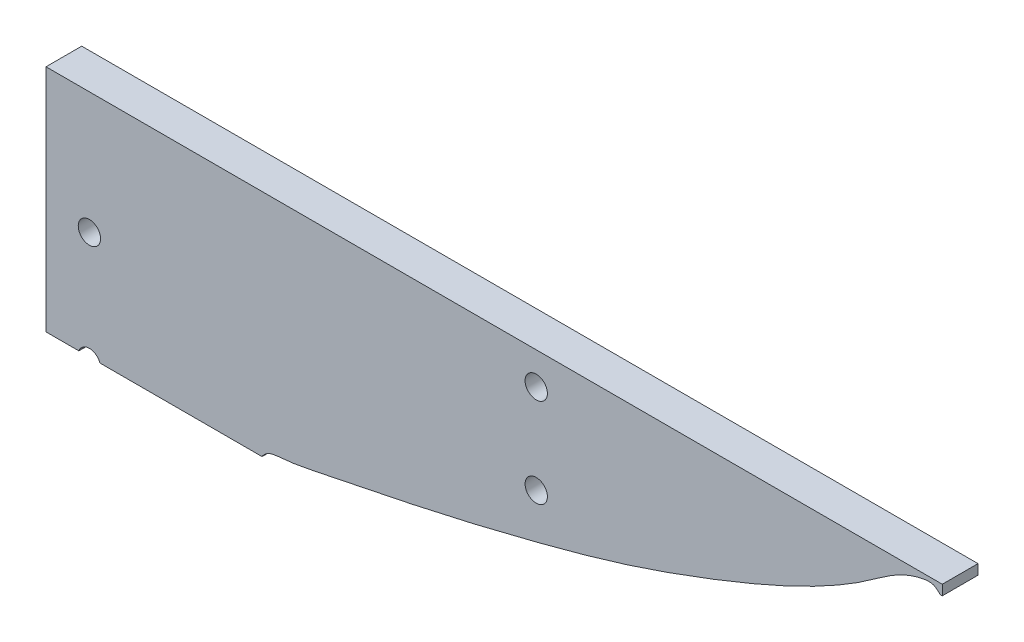
ISO-10303-21;
HEADER;
FILE_DESCRIPTION(('STEP AP214'),'2;1');
FILE_NAME('part.step','',(''),(''),'','','');
FILE_SCHEMA(('AUTOMOTIVE_DESIGN { 1 0 10303 214 1 1 1 1 }'));
ENDSEC;
DATA;
#1=APPLICATION_CONTEXT('core data for automotive mechanical design processes');
#2=APPLICATION_PROTOCOL_DEFINITION('international standard','automotive_design',2000,#1);
#3=PRODUCT_CONTEXT('',#1,'mechanical');
#4=PRODUCT('Part','Part','',(#3));
#5=PRODUCT_RELATED_PRODUCT_CATEGORY('part','',(#4));
#6=PRODUCT_DEFINITION_FORMATION('','',#4);
#7=PRODUCT_DEFINITION_CONTEXT('part definition',#1,'design');
#8=PRODUCT_DEFINITION('design','',#6,#7);
#9=PRODUCT_DEFINITION_SHAPE('','',#8);
#10=(LENGTH_UNIT() NAMED_UNIT(*) SI_UNIT(.MILLI.,.METRE.));
#11=(NAMED_UNIT(*) PLANE_ANGLE_UNIT() SI_UNIT($,.RADIAN.));
#12=(NAMED_UNIT(*) SI_UNIT($,.STERADIAN.) SOLID_ANGLE_UNIT());
#13=UNCERTAINTY_MEASURE_WITH_UNIT(LENGTH_MEASURE(1.E-05),#10,'distance_accuracy_value','');
#14=(GEOMETRIC_REPRESENTATION_CONTEXT(3) GLOBAL_UNCERTAINTY_ASSIGNED_CONTEXT((#13)) GLOBAL_UNIT_ASSIGNED_CONTEXT((#10,
#11,#12)) REPRESENTATION_CONTEXT('',''));
#15=CARTESIAN_POINT('',(0.,0.,0.));
#16=DIRECTION('',(0.,0.,1.));
#17=DIRECTION('',(1.,0.,0.));
#18=AXIS2_PLACEMENT_3D('',#15,#16,#17);
#19=CARTESIAN_POINT('',(17.1120450700349,-30.2965817213284,268.));
#20=DIRECTION('',(0.,0.,-1.));
#21=DIRECTION('',(-1.,0.,0.));
#22=AXIS2_PLACEMENT_3D('',#19,#20,#21);
#23=PLANE('',#22);
#24=CARTESIAN_POINT('',(-100.,-50.,268.));
#25=DIRECTION('',(0.,0.,-1.));
#26=DIRECTION('',(-1.,0.,0.));
#27=AXIS2_PLACEMENT_3D('',#24,#25,#26);
#28=CIRCLE('',#27,2.5);
#29=CARTESIAN_POINT('',(-97.6425404143795,-49.1679036701405,268.));
#30=VERTEX_POINT('',#29);
#31=CARTESIAN_POINT('',(-102.357685385855,-49.1685436744337,268.));
#32=VERTEX_POINT('',#31);
#33=EDGE_CURVE('E271',#30,#32,#28,.F.);
#34=ORIENTED_EDGE('',*,*,#33,.F.);
#35=CARTESIAN_POINT('',(-61.3284691167819,-49.1596786768937,268.));
#36=CARTESIAN_POINT('',(-73.4331592670355,-49.1634275257084,268.));
#37=CARTESIAN_POINT('',(-85.5378497845414,-49.1661379789345,268.));
#38=CARTESIAN_POINT('',(-97.6425404143795,-49.1679036701405,268.));
#39=B_SPLINE_CURVE_WITH_KNOTS('',3,(#35,#36,#37,#38),.UNSPECIFIED.,.F.,.F.,(4,4),
(0.249558177281323,1.),.UNSPECIFIED.);
#40=CARTESIAN_POINT('',(-61.3284691167819,-49.1596786768937,268.));
#41=VERTEX_POINT('',#40);
#42=EDGE_CURVE('E57',#30,#41,#39,.F.);
#43=ORIENTED_EDGE('',*,*,#42,.T.);
#44=CARTESIAN_POINT('',(90.4986161705741,0.,268.));
#45=CARTESIAN_POINT('',(90.460993760975,0.101798971429555,268.));
#46=CARTESIAN_POINT('',(90.3925716869674,0.187011990892654,268.));
#47=CARTESIAN_POINT('',(90.2359787684162,0.335064971160982,268.));
#48=CARTESIAN_POINT('',(90.1511215472738,0.400871782749084,268.));
#49=CARTESIAN_POINT('',(89.8975200885361,0.599507742605229,268.));
#50=CARTESIAN_POINT('',(89.7325323788648,0.737503647604979,268.));
#51=CARTESIAN_POINT('',(89.4655595987232,0.918657362101557,268.));
#52=CARTESIAN_POINT('',(89.3746892647177,0.975115261772072,268.));
#53=CARTESIAN_POINT('',(89.1860095946694,1.07353330751801,268.));
#54=CARTESIAN_POINT('',(89.087829148967,1.11471808901335,268.));
#55=CARTESIAN_POINT('',(88.8841315355537,1.18175893653473,268.));
#56=CARTESIAN_POINT('',(88.7784692306913,1.20769185659473,268.));
#57=CARTESIAN_POINT('',(88.5678653936302,1.24582942601215,268.));
#58=CARTESIAN_POINT('',(88.4620126637707,1.25840148848252,268.));
#59=CARTESIAN_POINT('',(88.1432711884111,1.2821610293223,268.));
#60=CARTESIAN_POINT('',(87.9284820156275,1.27992535578355,268.));
#61=CARTESIAN_POINT('',(87.5007692848221,1.25567140612821,268.));
#62=CARTESIAN_POINT('',(87.2888410227446,1.23461552094706,268.));
#63=CARTESIAN_POINT('',(86.6578629039191,1.14918852804751,268.));
#64=CARTESIAN_POINT('',(86.2438233475715,1.06161507295805,268.));
#65=CARTESIAN_POINT('',(85.0111622831581,0.75509720846469,268.));
#66=CARTESIAN_POINT('',(84.1980262023282,0.488821245687837,268.));
#67=CARTESIAN_POINT('',(82.6227430709735,-0.126448017694313,268.));
#68=CARTESIAN_POINT('',(81.8592891901086,-0.477860645027314,268.));
#69=CARTESIAN_POINT('',(79.6396114148434,-1.66003131844025,268.));
#70=CARTESIAN_POINT('',(78.2506945542024,-2.61261032644494,268.));
#71=CARTESIAN_POINT('',(76.1841211766647,-4.07188911121447,268.));
#72=CARTESIAN_POINT('',(75.4976799176439,-4.56248258251916,268.));
#73=CARTESIAN_POINT('',(74.1152658151134,-5.52752544320584,268.));
#74=CARTESIAN_POINT('',(73.4204228776363,-6.0039237505193,268.));
#75=CARTESIAN_POINT('',(71.315499682308,-7.39877290135613,268.));
#76=CARTESIAN_POINT('',(69.8839537206412,-8.28107378370755,268.));
#77=CARTESIAN_POINT('',(66.9812467229454,-9.97896059639708,268.));
#78=CARTESIAN_POINT('',(65.5105832519073,-10.7953844659546,268.));
#79=CARTESIAN_POINT('',(62.5414436915019,-12.3813935324912,268.));
#80=CARTESIAN_POINT('',(61.0425176373783,-13.1503815521859,268.));
#81=CARTESIAN_POINT('',(58.0157870229783,-14.6390744460416,268.));
#82=CARTESIAN_POINT('',(56.4908785981481,-15.3582396709279,268.));
#83=CARTESIAN_POINT('',(51.8890598924008,-17.4566312343581,268.));
#84=CARTESIAN_POINT('',(48.7860501937243,-18.7804252016329,268.));
#85=CARTESIAN_POINT('',(42.5456827222286,-21.3340963067129,268.));
#86=CARTESIAN_POINT('',(39.406210841033,-22.5620236467706,268.));
#87=CARTESIAN_POINT('',(33.0954653719989,-24.9372399560287,268.));
#88=CARTESIAN_POINT('',(29.9239536455423,-26.0851750318963,268.));
#89=CARTESIAN_POINT('',(23.5456823975533,-28.2755615353782,268.));
#90=CARTESIAN_POINT('',(20.3370110240277,-29.3155422840662,268.));
#91=CARTESIAN_POINT('',(13.887079116042,-31.2776211585907,268.));
#92=CARTESIAN_POINT('',(10.6453700530996,-32.2012961643472,268.));
#93=CARTESIAN_POINT('',(4.14072845552131,-33.9759313418385,268.));
#94=CARTESIAN_POINT('',(0.878330212973374,-34.8289046395145,268.));
#95=CARTESIAN_POINT('',(-5.65566984497051,-36.4941564641431,268.));
#96=CARTESIAN_POINT('',(-8.92810962490984,-37.3049529957394,268.));
#97=CARTESIAN_POINT('',(-15.4859271801644,-38.8746266919463,268.));
#98=CARTESIAN_POINT('',(-18.7718856839083,-39.6311194553094,268.));
#99=CARTESIAN_POINT('',(-25.3550010176112,-41.0923485571112,268.));
#100=CARTESIAN_POINT('',(-28.6521091009108,-41.7982403719291,268.));
#101=CARTESIAN_POINT('',(-35.2525574830584,-43.1797250799683,268.));
#102=CARTESIAN_POINT('',(-38.5549837469024,-43.8599171952072,268.));
#103=CARTESIAN_POINT('',(-43.5100113003951,-44.8733760345267,268.));
#104=CARTESIAN_POINT('',(-45.1616480688053,-45.2114167268525,268.));
#105=CARTESIAN_POINT('',(-47.6407400476689,-45.7103267513555,268.));
#106=CARTESIAN_POINT('',(-48.4673966782986,-45.8751720815977,268.));
#107=CARTESIAN_POINT('',(-50.121135924969,-46.2027403512291,268.));
#108=CARTESIAN_POINT('',(-50.9478057783205,-46.3677115866922,268.));
#109=CARTESIAN_POINT('',(-52.6037718886959,-46.682842221304,268.));
#110=CARTESIAN_POINT('',(-53.4335542319916,-46.8302998272869,268.));
#111=CARTESIAN_POINT('',(-54.6850395254958,-47.0132202737498,268.));
#112=CARTESIAN_POINT('',(-55.103304122214,-47.0680573049026,268.));
#113=CARTESIAN_POINT('',(-55.94209202885,-47.1642011811323,268.));
#114=CARTESIAN_POINT('',(-56.3630062569619,-47.2032921923246,268.));
#115=CARTESIAN_POINT('',(-57.2058433328034,-47.2755158582891,268.));
#116=CARTESIAN_POINT('',(-57.6272398904258,-47.3117575384893,268.));
#117=CARTESIAN_POINT('',(-58.4636797622931,-47.4217722811931,268.));
#118=CARTESIAN_POINT('',(-58.8794319946036,-47.4913574551859,268.));
#119=CARTESIAN_POINT('',(-59.4902276948746,-47.6715432714835,268.));
#120=CARTESIAN_POINT('',(-59.6915862205313,-47.744838110977,268.));
#121=CARTESIAN_POINT('',(-59.9878781547935,-47.8887236396108,268.));
#122=CARTESIAN_POINT('',(-60.0862397709866,-47.9429034811649,268.));
#123=CARTESIAN_POINT('',(-60.2731116971085,-48.0610483049043,268.));
#124=CARTESIAN_POINT('',(-60.362608396286,-48.1250935632572,268.));
#125=CARTESIAN_POINT('',(-60.6233237629664,-48.3270440001711,268.));
#126=CARTESIAN_POINT('',(-60.7844878959435,-48.4776418183054,268.));
#127=CARTESIAN_POINT('',(-61.0228611861699,-48.7077964374238,268.));
#128=CARTESIAN_POINT('',(-61.1012985715874,-48.7858055481782,268.));
#129=CARTESIAN_POINT('',(-61.2416001670571,-48.956251550771,268.));
#130=CARTESIAN_POINT('',(-61.3018923424804,-49.0521197570179,268.));
#131=CARTESIAN_POINT('',(-61.3284691167819,-49.1596786768938,268.));
#132=B_SPLINE_CURVE_WITH_KNOTS('',3,(#44,#45,#46,#47,#48,#49,#50,#51,#52,#53,#54,#55,#56,#57,
#58,#59,#60,#61,#62,#63,#64,#65,#66,#67,#68,#69,#70,#71,#72,#73,#74,#75,#76,#77,#78,#79,#80,#81,
#82,#83,#84,#85,#86,#87,#88,#89,#90,#91,#92,#93,#94,#95,#96,#97,#98,#99,#100,#101,#102,#103,
#104,#105,#106,#107,#108,#109,#110,#111,#112,#113,#114,#115,#116,#117,#118,#119,#120,#121,#122,
#123,#124,#125,#126,#127,#128,#129,#130,#131),.UNSPECIFIED.,.F.,.F.,(4,2,2,2,2,2,2,2,2,2,2,2,2,
2,2,2,2,2,2,2,2,2,2,2,2,2,2,2,2,2,2,2,2,2,2,2,2,2,2,2,2,2,2,4),(0.,0.001953125,
0.00390625000000011,0.00781250000000011,0.00976562500000011,0.01171875,0.0136718749999999,
0.0156249999999999,0.0195312499999997,0.0234374999999996,0.0312499999999996,0.0468749999999998,
0.0625,0.0937500000000001,0.109375,0.125,0.15625,0.1875,0.21875,0.25,0.3125,0.375,0.4375,0.5,
0.5625,0.625,0.6875,0.75,0.8125,0.875,0.90625,0.921875,0.9375,0.953125,0.9609375,0.96875,
0.9765625,0.984375,0.98828125,0.990234375,0.9921875,0.99609375,0.998046875,1.),.UNSPECIFIED.);
#133=CARTESIAN_POINT('',(90.4986161705741,0.,268.));
#134=VERTEX_POINT('',#133);
#135=EDGE_CURVE('E224',#41,#134,#132,.F.);
#136=ORIENTED_EDGE('',*,*,#135,.T.);
#137=DIRECTION('',(1.,1.89613810274532E-13,0.));
#138=VECTOR('',#137,1.);
#139=CARTESIAN_POINT('',(90.4986161705741,0.,268.));
#140=LINE('',#139,#138);
#141=CARTESIAN_POINT('',(91.0031001248854,0.,268.));
#142=VERTEX_POINT('',#141);
#143=EDGE_CURVE('E95',#134,#142,#140,.T.);
#144=ORIENTED_EDGE('',*,*,#143,.T.);
#145=DIRECTION('',(0.,1.,0.));
#146=VECTOR('',#145,1.);
#147=CARTESIAN_POINT('',(91.0031001248854,2.25600000000004,268.));
#148=LINE('',#147,#146);
#149=CARTESIAN_POINT('',(91.0031001248854,2.25600000000004,268.));
#150=VERTEX_POINT('',#149);
#151=EDGE_CURVE('E112',#142,#150,#148,.T.);
#152=ORIENTED_EDGE('',*,*,#151,.T.);
#153=DIRECTION('',(-1.,0.,0.));
#154=VECTOR('',#153,1.);
#155=CARTESIAN_POINT('',(91.0031001248854,2.25600000000004,268.));
#156=LINE('',#155,#154);
#157=CARTESIAN_POINT('',(-109.718724519512,2.25600000000002,268.));
#158=VERTEX_POINT('',#157);
#159=EDGE_CURVE('E104',#150,#158,#156,.T.);
#160=ORIENTED_EDGE('',*,*,#159,.T.);
#161=DIRECTION('',(0.,-1.,0.));
#162=VECTOR('',#161,1.);
#163=CARTESIAN_POINT('',(-109.718724519512,-49.1693552074664,268.));
#164=LINE('',#163,#162);
#165=CARTESIAN_POINT('',(-109.718724519512,-49.1693552074664,268.));
#166=VERTEX_POINT('',#165);
#167=EDGE_CURVE('E109',#158,#166,#164,.T.);
#168=ORIENTED_EDGE('',*,*,#167,.T.);
#169=CARTESIAN_POINT('',(-102.357685458832,-49.1685438813678,268.));
#170=CARTESIAN_POINT('',(-104.811365143178,-49.1688523834661,268.));
#171=CARTESIAN_POINT('',(-107.265044830779,-49.1691225655411,268.));
#172=CARTESIAN_POINT('',(-109.718724519512,-49.1693552074664,268.));
#173=B_SPLINE_CURVE_WITH_KNOTS('',3,(#169,#170,#171,#172),.UNSPECIFIED.,.F.,.F.,(4,4),(0.,
0.152118208322103),.UNSPECIFIED.);
#174=EDGE_CURVE('E131',#166,#32,#173,.F.);
#175=ORIENTED_EDGE('',*,*,#174,.T.);
#176=EDGE_LOOP('',(#34,#43,#136,#144,#152,#160,#168,#175));
#177=FACE_BOUND('',#176,.T.);
#178=CARTESIAN_POINT('',(0.0705666698621599,-4.96037406111782,268.));
#179=DIRECTION('',(0.,0.,-1.));
#180=DIRECTION('',(-1.,0.,0.));
#181=AXIS2_PLACEMENT_3D('',#178,#179,#180);
#182=CIRCLE('',#181,2.5);
#183=CARTESIAN_POINT('',(-2.42943333013784,-4.96037406111782,268.));
#184=VERTEX_POINT('',#183);
#185=EDGE_CURVE('E267',#184,#184,#182,.F.);
#186=ORIENTED_EDGE('',*,*,#185,.F.);
#187=EDGE_LOOP('',(#186));
#188=FACE_BOUND('',#187,.T.);
#189=CARTESIAN_POINT('',(0.0705666698621599,-25.,268.));
#190=DIRECTION('',(0.,0.,-1.));
#191=DIRECTION('',(-1.,0.,0.));
#192=AXIS2_PLACEMENT_3D('',#189,#190,#191);
#193=CIRCLE('',#192,2.5);
#194=CARTESIAN_POINT('',(-2.42943333013784,-25.,268.));
#195=VERTEX_POINT('',#194);
#196=EDGE_CURVE('E268',#195,#195,#193,.F.);
#197=ORIENTED_EDGE('',*,*,#196,.F.);
#198=EDGE_LOOP('',(#197));
#199=FACE_BOUND('',#198,.T.);
#200=CARTESIAN_POINT('',(-100.,-25.,268.));
#201=DIRECTION('',(0.,0.,-1.));
#202=DIRECTION('',(-1.,0.,0.));
#203=AXIS2_PLACEMENT_3D('',#200,#201,#202);
#204=CIRCLE('',#203,2.5);
#205=CARTESIAN_POINT('',(-102.5,-25.,268.));
#206=VERTEX_POINT('',#205);
#207=EDGE_CURVE('E290',#206,#206,#204,.F.);
#208=ORIENTED_EDGE('',*,*,#207,.F.);
#209=EDGE_LOOP('',(#208));
#210=FACE_BOUND('',#209,.T.);
#211=ADVANCED_FACE('F30',(#177,#188,#199,#210),#23,.F.);
#212=CARTESIAN_POINT('',(17.1120450700349,-30.2965817213284,260.));
#213=DIRECTION('',(0.,0.,-1.));
#214=DIRECTION('',(-1.,0.,0.));
#215=AXIS2_PLACEMENT_3D('',#212,#213,#214);
#216=PLANE('',#215);
#217=CARTESIAN_POINT('',(-97.6425404143795,-49.1679036701405,260.));
#218=CARTESIAN_POINT('',(-85.5378497845414,-49.1661379789345,260.));
#219=CARTESIAN_POINT('',(-73.4331592670355,-49.1634275257084,260.));
#220=CARTESIAN_POINT('',(-61.3284691167819,-49.1596786768937,260.));
#221=B_SPLINE_CURVE_WITH_KNOTS('',3,(#217,#218,#219,#220),.UNSPECIFIED.,.F.,.F.,(4,4),
(0.249558177281324,1.),.UNSPECIFIED.);
#222=CARTESIAN_POINT('',(-97.6425404144108,-49.167903455592,260.));
#223=VERTEX_POINT('',#222);
#224=CARTESIAN_POINT('',(-61.3284691167819,-49.1596786768937,260.));
#225=VERTEX_POINT('',#224);
#226=EDGE_CURVE('E85',#223,#225,#221,.T.);
#227=ORIENTED_EDGE('',*,*,#226,.F.);
#228=CARTESIAN_POINT('',(-100.,-50.,260.));
#229=DIRECTION('',(0.,0.,-1.));
#230=DIRECTION('',(-1.,0.,0.));
#231=AXIS2_PLACEMENT_3D('',#228,#229,#230);
#232=CIRCLE('',#231,2.5);
#233=CARTESIAN_POINT('',(-102.357685385894,-49.1685436745432,260.));
#234=VERTEX_POINT('',#233);
#235=EDGE_CURVE('E48',#223,#234,#232,.F.);
#236=ORIENTED_EDGE('',*,*,#235,.T.);
#237=CARTESIAN_POINT('',(-109.718724519512,-49.1693552074664,260.));
#238=CARTESIAN_POINT('',(-107.265044830779,-49.1691225655411,260.));
#239=CARTESIAN_POINT('',(-104.811365143178,-49.1688523834661,260.));
#240=CARTESIAN_POINT('',(-102.357685458832,-49.1685438813678,260.));
#241=B_SPLINE_CURVE_WITH_KNOTS('',3,(#237,#238,#239,#240),.UNSPECIFIED.,.F.,.F.,(4,4),(0.,
0.152118208322103),.UNSPECIFIED.);
#242=CARTESIAN_POINT('',(-109.718724519512,-49.1693552074664,260.));
#243=VERTEX_POINT('',#242);
#244=EDGE_CURVE('E153',#243,#234,#241,.T.);
#245=ORIENTED_EDGE('',*,*,#244,.F.);
#246=DIRECTION('',(0.,-1.,0.));
#247=VECTOR('',#246,1.);
#248=CARTESIAN_POINT('',(-109.718724519512,-49.1693552074664,260.));
#249=LINE('',#248,#247);
#250=CARTESIAN_POINT('',(-109.718724519512,2.25600000000002,260.));
#251=VERTEX_POINT('',#250);
#252=EDGE_CURVE('E187',#251,#243,#249,.T.);
#253=ORIENTED_EDGE('',*,*,#252,.F.);
#254=DIRECTION('',(-1.,0.,0.));
#255=VECTOR('',#254,1.);
#256=CARTESIAN_POINT('',(91.0031001248854,2.25600000000004,260.));
#257=LINE('',#256,#255);
#258=CARTESIAN_POINT('',(91.0031001248854,2.25600000000004,260.));
#259=VERTEX_POINT('',#258);
#260=EDGE_CURVE('E121',#259,#251,#257,.T.);
#261=ORIENTED_EDGE('',*,*,#260,.F.);
#262=DIRECTION('',(0.,1.,0.));
#263=VECTOR('',#262,1.);
#264=CARTESIAN_POINT('',(91.0031001248854,2.25600000000004,260.));
#265=LINE('',#264,#263);
#266=CARTESIAN_POINT('',(91.0031001248854,0.,260.));
#267=VERTEX_POINT('',#266);
#268=EDGE_CURVE('E181',#267,#259,#265,.T.);
#269=ORIENTED_EDGE('',*,*,#268,.F.);
#270=DIRECTION('',(1.,1.89613810274532E-13,0.));
#271=VECTOR('',#270,1.);
#272=CARTESIAN_POINT('',(90.4986161705741,0.,260.));
#273=LINE('',#272,#271);
#274=CARTESIAN_POINT('',(90.4986161705741,0.,260.));
#275=VERTEX_POINT('',#274);
#276=EDGE_CURVE('E186',#275,#267,#273,.T.);
#277=ORIENTED_EDGE('',*,*,#276,.F.);
#278=CARTESIAN_POINT('',(-61.3284691167819,-49.1596786768938,260.));
#279=CARTESIAN_POINT('',(-61.3018923424804,-49.0521197570179,260.));
#280=CARTESIAN_POINT('',(-61.2416001670571,-48.956251550771,260.));
#281=CARTESIAN_POINT('',(-61.1012985715874,-48.7858055481782,260.));
#282=CARTESIAN_POINT('',(-61.0228611861699,-48.7077964374238,260.));
#283=CARTESIAN_POINT('',(-60.7844878959435,-48.4776418183054,260.));
#284=CARTESIAN_POINT('',(-60.6233237629664,-48.3270440001711,260.));
#285=CARTESIAN_POINT('',(-60.362608396286,-48.1250935632572,260.));
#286=CARTESIAN_POINT('',(-60.2731116971085,-48.0610483049043,260.));
#287=CARTESIAN_POINT('',(-60.0862397709866,-47.9429034811649,260.));
#288=CARTESIAN_POINT('',(-59.9878781547935,-47.8887236396108,260.));
#289=CARTESIAN_POINT('',(-59.6915862205313,-47.744838110977,260.));
#290=CARTESIAN_POINT('',(-59.4902276948746,-47.6715432714835,260.));
#291=CARTESIAN_POINT('',(-58.8794319946036,-47.4913574551859,260.));
#292=CARTESIAN_POINT('',(-58.4636797622931,-47.4217722811931,260.));
#293=CARTESIAN_POINT('',(-57.6272398904258,-47.3117575384893,260.));
#294=CARTESIAN_POINT('',(-57.2058433328034,-47.2755158582891,260.));
#295=CARTESIAN_POINT('',(-56.3630062569619,-47.2032921923246,260.));
#296=CARTESIAN_POINT('',(-55.94209202885,-47.1642011811323,260.));
#297=CARTESIAN_POINT('',(-55.103304122214,-47.0680573049026,260.));
#298=CARTESIAN_POINT('',(-54.6850395254958,-47.0132202737498,260.));
#299=CARTESIAN_POINT('',(-53.4335542319916,-46.8302998272869,260.));
#300=CARTESIAN_POINT('',(-52.6037718886959,-46.682842221304,260.));
#301=CARTESIAN_POINT('',(-50.9478057783205,-46.3677115866922,260.));
#302=CARTESIAN_POINT('',(-50.121135924969,-46.2027403512291,260.));
#303=CARTESIAN_POINT('',(-48.4673966782986,-45.8751720815977,260.));
#304=CARTESIAN_POINT('',(-47.6407400476689,-45.7103267513555,260.));
#305=CARTESIAN_POINT('',(-45.1616480688053,-45.2114167268525,260.));
#306=CARTESIAN_POINT('',(-43.5100113003951,-44.8733760345267,260.));
#307=CARTESIAN_POINT('',(-38.5549837469024,-43.8599171952072,260.));
#308=CARTESIAN_POINT('',(-35.2525574830584,-43.1797250799683,260.));
#309=CARTESIAN_POINT('',(-28.6521091009108,-41.7982403719291,260.));
#310=CARTESIAN_POINT('',(-25.3550010176112,-41.0923485571112,260.));
#311=CARTESIAN_POINT('',(-18.7718856839083,-39.6311194553094,260.));
#312=CARTESIAN_POINT('',(-15.4859271801644,-38.8746266919463,260.));
#313=CARTESIAN_POINT('',(-8.92810962490984,-37.3049529957394,260.));
#314=CARTESIAN_POINT('',(-5.65566984497051,-36.4941564641431,260.));
#315=CARTESIAN_POINT('',(0.878330212973374,-34.8289046395145,260.));
#316=CARTESIAN_POINT('',(4.14072845552131,-33.9759313418385,260.));
#317=CARTESIAN_POINT('',(10.6453700530996,-32.2012961643472,260.));
#318=CARTESIAN_POINT('',(13.887079116042,-31.2776211585907,260.));
#319=CARTESIAN_POINT('',(20.3370110240277,-29.3155422840662,260.));
#320=CARTESIAN_POINT('',(23.5456823975533,-28.2755615353782,260.));
#321=CARTESIAN_POINT('',(29.9239536455423,-26.0851750318963,260.));
#322=CARTESIAN_POINT('',(33.0954653719989,-24.9372399560287,260.));
#323=CARTESIAN_POINT('',(39.406210841033,-22.5620236467706,260.));
#324=CARTESIAN_POINT('',(42.5456827222286,-21.3340963067129,260.));
#325=CARTESIAN_POINT('',(48.7860501937243,-18.7804252016329,260.));
#326=CARTESIAN_POINT('',(51.8890598924008,-17.4566312343581,260.));
#327=CARTESIAN_POINT('',(56.4908785981481,-15.3582396709279,260.));
#328=CARTESIAN_POINT('',(58.0157870229783,-14.6390744460416,260.));
#329=CARTESIAN_POINT('',(61.0425176373783,-13.1503815521859,260.));
#330=CARTESIAN_POINT('',(62.5414436915019,-12.3813935324912,260.));
#331=CARTESIAN_POINT('',(65.5105832519073,-10.7953844659546,260.));
#332=CARTESIAN_POINT('',(66.9812467229454,-9.97896059639708,260.));
#333=CARTESIAN_POINT('',(69.8839537206412,-8.28107378370755,260.));
#334=CARTESIAN_POINT('',(71.315499682308,-7.39877290135613,260.));
#335=CARTESIAN_POINT('',(73.4204228776363,-6.0039237505193,260.));
#336=CARTESIAN_POINT('',(74.1152658151134,-5.52752544320584,260.));
#337=CARTESIAN_POINT('',(75.4976799176439,-4.56248258251916,260.));
#338=CARTESIAN_POINT('',(76.1841211766647,-4.07188911121447,260.));
#339=CARTESIAN_POINT('',(78.2506945542024,-2.61261032644494,260.));
#340=CARTESIAN_POINT('',(79.6396114148434,-1.66003131844025,260.));
#341=CARTESIAN_POINT('',(81.8592891901086,-0.477860645027314,260.));
#342=CARTESIAN_POINT('',(82.6227430709735,-0.126448017694313,260.));
#343=CARTESIAN_POINT('',(84.1980262023282,0.488821245687837,260.));
#344=CARTESIAN_POINT('',(85.0111622831581,0.75509720846469,260.));
#345=CARTESIAN_POINT('',(86.2438233475715,1.06161507295805,260.));
#346=CARTESIAN_POINT('',(86.6578629039191,1.14918852804751,260.));
#347=CARTESIAN_POINT('',(87.2888410227446,1.23461552094706,260.));
#348=CARTESIAN_POINT('',(87.5007692848221,1.25567140612821,260.));
#349=CARTESIAN_POINT('',(87.9284820156275,1.27992535578355,260.));
#350=CARTESIAN_POINT('',(88.1432711884111,1.2821610293223,260.));
#351=CARTESIAN_POINT('',(88.4620126637707,1.25840148848252,260.));
#352=CARTESIAN_POINT('',(88.5678653936302,1.24582942601215,260.));
#353=CARTESIAN_POINT('',(88.7784692306913,1.20769185659473,260.));
#354=CARTESIAN_POINT('',(88.8841315355537,1.18175893653473,260.));
#355=CARTESIAN_POINT('',(89.087829148967,1.11471808901335,260.));
#356=CARTESIAN_POINT('',(89.1860095946694,1.07353330751801,260.));
#357=CARTESIAN_POINT('',(89.3746892647177,0.975115261772072,260.));
#358=CARTESIAN_POINT('',(89.4655595987232,0.918657362101557,260.));
#359=CARTESIAN_POINT('',(89.7325323788648,0.737503647604979,260.));
#360=CARTESIAN_POINT('',(89.8975200885361,0.599507742605229,260.));
#361=CARTESIAN_POINT('',(90.1511215472738,0.400871782749084,260.));
#362=CARTESIAN_POINT('',(90.2359787684162,0.335064971160982,260.));
#363=CARTESIAN_POINT('',(90.3925716869674,0.187011990892654,260.));
#364=CARTESIAN_POINT('',(90.460993760975,0.101798971429555,260.));
#365=CARTESIAN_POINT('',(90.4986161705741,0.,260.));
#366=B_SPLINE_CURVE_WITH_KNOTS('',3,(#278,#279,#280,#281,#282,#283,#284,#285,#286,#287,#288,
#289,#290,#291,#292,#293,#294,#295,#296,#297,#298,#299,#300,#301,#302,#303,#304,#305,#306,#307,
#308,#309,#310,#311,#312,#313,#314,#315,#316,#317,#318,#319,#320,#321,#322,#323,#324,#325,#326,
#327,#328,#329,#330,#331,#332,#333,#334,#335,#336,#337,#338,#339,#340,#341,#342,#343,#344,#345,
#346,#347,#348,#349,#350,#351,#352,#353,#354,#355,#356,#357,#358,#359,#360,#361,#362,#363,#364,
#365),.UNSPECIFIED.,.F.,.F.,(4,2,2,2,2,2,2,2,2,2,2,2,2,2,2,2,2,2,2,2,2,2,2,2,2,2,2,2,2,2,2,2,2,
2,2,2,2,2,2,2,2,2,2,4),(0.,0.00195312499999989,0.00390624999999989,0.00781249999999978,
0.00976562499999978,0.0117187499999997,0.0156249999999997,0.0234374999999998,0.0312499999999998,
0.0390624999999998,0.0468749999999998,0.0624999999999999,0.0781249999999999,0.09375,0.125,
0.1875,0.25,0.3125,0.375,0.4375,0.5,0.5625,0.625,0.6875,0.75,0.78125,0.8125,0.84375,0.875,
0.890625,0.90625,0.9375,0.953125,0.96875,0.9765625,0.98046875,0.984375,0.986328125,0.98828125,
0.990234375,0.9921875,0.99609375,0.998046875,1.),.UNSPECIFIED.);
#367=EDGE_CURVE('E242',#225,#275,#366,.T.);
#368=ORIENTED_EDGE('',*,*,#367,.F.);
#369=EDGE_LOOP('',(#227,#236,#245,#253,#261,#269,#277,#368));
#370=FACE_BOUND('',#369,.T.);
#371=CARTESIAN_POINT('',(0.0705666698621599,-4.96037406111782,260.));
#372=DIRECTION('',(0.,0.,-1.));
#373=DIRECTION('',(-1.,0.,0.));
#374=AXIS2_PLACEMENT_3D('',#371,#372,#373);
#375=CIRCLE('',#374,2.5);
#376=CARTESIAN_POINT('',(-2.42943333013784,-4.96037406111782,260.));
#377=VERTEX_POINT('',#376);
#378=EDGE_CURVE('E264',#377,#377,#375,.F.);
#379=ORIENTED_EDGE('',*,*,#378,.T.);
#380=EDGE_LOOP('',(#379));
#381=FACE_BOUND('',#380,.T.);
#382=CARTESIAN_POINT('',(0.0705666698621599,-25.,260.));
#383=DIRECTION('',(0.,0.,-1.));
#384=DIRECTION('',(-1.,0.,0.));
#385=AXIS2_PLACEMENT_3D('',#382,#383,#384);
#386=CIRCLE('',#385,2.5);
#387=CARTESIAN_POINT('',(-2.42943333013784,-25.,260.));
#388=VERTEX_POINT('',#387);
#389=EDGE_CURVE('E269',#388,#388,#386,.F.);
#390=ORIENTED_EDGE('',*,*,#389,.T.);
#391=EDGE_LOOP('',(#390));
#392=FACE_BOUND('',#391,.T.);
#393=CARTESIAN_POINT('',(-100.,-25.,260.));
#394=DIRECTION('',(0.,0.,-1.));
#395=DIRECTION('',(-1.,0.,0.));
#396=AXIS2_PLACEMENT_3D('',#393,#394,#395);
#397=CIRCLE('',#396,2.5);
#398=CARTESIAN_POINT('',(-102.5,-25.,260.));
#399=VERTEX_POINT('',#398);
#400=EDGE_CURVE('E36',#399,#399,#397,.F.);
#401=ORIENTED_EDGE('',*,*,#400,.T.);
#402=EDGE_LOOP('',(#401));
#403=FACE_BOUND('',#402,.T.);
#404=ADVANCED_FACE('F171',(#370,#381,#392,#403),#216,.T.);
#405=CARTESIAN_POINT('',(-109.718724519512,-49.1693552074664,268.));
#406=CARTESIAN_POINT('',(-93.58863913527,-49.1678258578389,268.));
#407=CARTESIAN_POINT('',(-77.4585537999637,-49.1646741991331,268.));
#408=CARTESIAN_POINT('',(-61.3284691167819,-49.1596786768937,268.));
#409=B_SPLINE_CURVE_WITH_KNOTS('',3,(#405,#406,#407,#408),.UNSPECIFIED.,.F.,.F.,(4,4),(0.,1.),.UNSPECIFIED.);
#410=DIRECTION('',(0.,0.,-1.));
#411=VECTOR('',#410,1.);
#412=SURFACE_OF_LINEAR_EXTRUSION('',#409,#411);
#413=DIRECTION('',(0.,0.,-1.));
#414=VECTOR('',#413,1.);
#415=CARTESIAN_POINT('',(-102.357685458832,-49.1685438813678,268.));
#416=LINE('',#415,#414);
#417=EDGE_CURVE('E11',#32,#234,#416,.T.);
#418=ORIENTED_EDGE('',*,*,#417,.F.);
#419=ORIENTED_EDGE('',*,*,#174,.F.);
#420=DIRECTION('',(0.,0.,-1.));
#421=VECTOR('',#420,1.);
#422=CARTESIAN_POINT('',(-109.718724519512,-49.1693552074664,268.));
#423=LINE('',#422,#421);
#424=EDGE_CURVE('E125',#166,#243,#423,.T.);
#425=ORIENTED_EDGE('',*,*,#424,.T.);
#426=ORIENTED_EDGE('',*,*,#244,.T.);
#427=EDGE_LOOP('',(#418,#419,#425,#426));
#428=FACE_BOUND('',#427,.T.);
#429=ADVANCED_FACE('F159',(#428),#412,.F.);
#430=DIRECTION('',(0.,0.,-1.));
#431=VECTOR('',#430,1.);
#432=CARTESIAN_POINT('',(-97.6425404143795,-49.1679036701405,268.));
#433=LINE('',#432,#431);
#434=EDGE_CURVE('E41',#223,#30,#433,.F.);
#435=ORIENTED_EDGE('',*,*,#434,.F.);
#436=ORIENTED_EDGE('',*,*,#226,.T.);
#437=DIRECTION('',(0.,0.,-1.));
#438=VECTOR('',#437,1.);
#439=CARTESIAN_POINT('',(-61.3284691167819,-49.1596786768937,268.));
#440=LINE('',#439,#438);
#441=EDGE_CURVE('E141',#41,#225,#440,.T.);
#442=ORIENTED_EDGE('',*,*,#441,.F.);
#443=ORIENTED_EDGE('',*,*,#42,.F.);
#444=EDGE_LOOP('',(#435,#436,#442,#443));
#445=FACE_BOUND('',#444,.T.);
#446=ADVANCED_FACE('F170',(#445),#412,.F.);
#447=CARTESIAN_POINT('',(-61.3284691167819,-49.1596786768938,268.));
#448=CARTESIAN_POINT('',(-61.3018923424804,-49.0521197570179,268.));
#449=CARTESIAN_POINT('',(-61.2416001670571,-48.956251550771,268.));
#450=CARTESIAN_POINT('',(-61.1012985715874,-48.7858055481782,268.));
#451=CARTESIAN_POINT('',(-61.0228611861699,-48.7077964374238,268.));
#452=CARTESIAN_POINT('',(-60.7844878959435,-48.4776418183054,268.));
#453=CARTESIAN_POINT('',(-60.6233237629664,-48.3270440001711,268.));
#454=CARTESIAN_POINT('',(-60.362608396286,-48.1250935632572,268.));
#455=CARTESIAN_POINT('',(-60.2731116971085,-48.0610483049043,268.));
#456=CARTESIAN_POINT('',(-60.0862397709866,-47.9429034811649,268.));
#457=CARTESIAN_POINT('',(-59.9878781547935,-47.8887236396108,268.));
#458=CARTESIAN_POINT('',(-59.6915862205313,-47.744838110977,268.));
#459=CARTESIAN_POINT('',(-59.4902276948746,-47.6715432714835,268.));
#460=CARTESIAN_POINT('',(-58.8794319946036,-47.4913574551859,268.));
#461=CARTESIAN_POINT('',(-58.4636797622931,-47.4217722811931,268.));
#462=CARTESIAN_POINT('',(-57.6272398904258,-47.3117575384893,268.));
#463=CARTESIAN_POINT('',(-57.2058433328034,-47.2755158582891,268.));
#464=CARTESIAN_POINT('',(-56.3630062569619,-47.2032921923246,268.));
#465=CARTESIAN_POINT('',(-55.94209202885,-47.1642011811323,268.));
#466=CARTESIAN_POINT('',(-55.103304122214,-47.0680573049026,268.));
#467=CARTESIAN_POINT('',(-54.6850395254958,-47.0132202737498,268.));
#468=CARTESIAN_POINT('',(-53.4335542319916,-46.8302998272869,268.));
#469=CARTESIAN_POINT('',(-52.6037718886959,-46.682842221304,268.));
#470=CARTESIAN_POINT('',(-50.9478057783205,-46.3677115866922,268.));
#471=CARTESIAN_POINT('',(-50.121135924969,-46.2027403512291,268.));
#472=CARTESIAN_POINT('',(-48.4673966782986,-45.8751720815977,268.));
#473=CARTESIAN_POINT('',(-47.6407400476689,-45.7103267513555,268.));
#474=CARTESIAN_POINT('',(-45.1616480688053,-45.2114167268525,268.));
#475=CARTESIAN_POINT('',(-43.5100113003951,-44.8733760345267,268.));
#476=CARTESIAN_POINT('',(-38.5549837469024,-43.8599171952072,268.));
#477=CARTESIAN_POINT('',(-35.2525574830584,-43.1797250799683,268.));
#478=CARTESIAN_POINT('',(-28.6521091009108,-41.7982403719291,268.));
#479=CARTESIAN_POINT('',(-25.3550010176112,-41.0923485571112,268.));
#480=CARTESIAN_POINT('',(-18.7718856839083,-39.6311194553094,268.));
#481=CARTESIAN_POINT('',(-15.4859271801644,-38.8746266919463,268.));
#482=CARTESIAN_POINT('',(-8.92810962490984,-37.3049529957394,268.));
#483=CARTESIAN_POINT('',(-5.65566984497051,-36.4941564641431,268.));
#484=CARTESIAN_POINT('',(0.878330212973374,-34.8289046395145,268.));
#485=CARTESIAN_POINT('',(4.14072845552131,-33.9759313418385,268.));
#486=CARTESIAN_POINT('',(10.6453700530996,-32.2012961643472,268.));
#487=CARTESIAN_POINT('',(13.887079116042,-31.2776211585907,268.));
#488=CARTESIAN_POINT('',(20.3370110240277,-29.3155422840662,268.));
#489=CARTESIAN_POINT('',(23.5456823975533,-28.2755615353782,268.));
#490=CARTESIAN_POINT('',(29.9239536455423,-26.0851750318963,268.));
#491=CARTESIAN_POINT('',(33.0954653719989,-24.9372399560287,268.));
#492=CARTESIAN_POINT('',(39.406210841033,-22.5620236467706,268.));
#493=CARTESIAN_POINT('',(42.5456827222286,-21.3340963067129,268.));
#494=CARTESIAN_POINT('',(48.7860501937243,-18.7804252016329,268.));
#495=CARTESIAN_POINT('',(51.8890598924008,-17.4566312343581,268.));
#496=CARTESIAN_POINT('',(56.4908785981481,-15.3582396709279,268.));
#497=CARTESIAN_POINT('',(58.0157870229783,-14.6390744460416,268.));
#498=CARTESIAN_POINT('',(61.0425176373783,-13.1503815521859,268.));
#499=CARTESIAN_POINT('',(62.5414436915019,-12.3813935324912,268.));
#500=CARTESIAN_POINT('',(65.5105832519073,-10.7953844659546,268.));
#501=CARTESIAN_POINT('',(66.9812467229454,-9.97896059639708,268.));
#502=CARTESIAN_POINT('',(69.8839537206412,-8.28107378370755,268.));
#503=CARTESIAN_POINT('',(71.315499682308,-7.39877290135613,268.));
#504=CARTESIAN_POINT('',(73.4204228776363,-6.0039237505193,268.));
#505=CARTESIAN_POINT('',(74.1152658151134,-5.52752544320584,268.));
#506=CARTESIAN_POINT('',(75.4976799176439,-4.56248258251916,268.));
#507=CARTESIAN_POINT('',(76.1841211766647,-4.07188911121447,268.));
#508=CARTESIAN_POINT('',(78.2506945542024,-2.61261032644494,268.));
#509=CARTESIAN_POINT('',(79.6396114148434,-1.66003131844025,268.));
#510=CARTESIAN_POINT('',(81.8592891901086,-0.477860645027314,268.));
#511=CARTESIAN_POINT('',(82.6227430709735,-0.126448017694313,268.));
#512=CARTESIAN_POINT('',(84.1980262023282,0.488821245687837,268.));
#513=CARTESIAN_POINT('',(85.0111622831581,0.75509720846469,268.));
#514=CARTESIAN_POINT('',(86.2438233475715,1.06161507295805,268.));
#515=CARTESIAN_POINT('',(86.6578629039191,1.14918852804751,268.));
#516=CARTESIAN_POINT('',(87.2888410227446,1.23461552094706,268.));
#517=CARTESIAN_POINT('',(87.5007692848221,1.25567140612821,268.));
#518=CARTESIAN_POINT('',(87.9284820156275,1.27992535578355,268.));
#519=CARTESIAN_POINT('',(88.1432711884111,1.2821610293223,268.));
#520=CARTESIAN_POINT('',(88.4620126637707,1.25840148848252,268.));
#521=CARTESIAN_POINT('',(88.5678653936302,1.24582942601215,268.));
#522=CARTESIAN_POINT('',(88.7784692306913,1.20769185659473,268.));
#523=CARTESIAN_POINT('',(88.8841315355537,1.18175893653473,268.));
#524=CARTESIAN_POINT('',(89.087829148967,1.11471808901335,268.));
#525=CARTESIAN_POINT('',(89.1860095946694,1.07353330751801,268.));
#526=CARTESIAN_POINT('',(89.3746892647177,0.975115261772072,268.));
#527=CARTESIAN_POINT('',(89.4655595987232,0.918657362101557,268.));
#528=CARTESIAN_POINT('',(89.7325323788648,0.737503647604979,268.));
#529=CARTESIAN_POINT('',(89.8975200885361,0.599507742605229,268.));
#530=CARTESIAN_POINT('',(90.1511215472738,0.400871782749084,268.));
#531=CARTESIAN_POINT('',(90.2359787684162,0.335064971160982,268.));
#532=CARTESIAN_POINT('',(90.3925716869674,0.187011990892654,268.));
#533=CARTESIAN_POINT('',(90.460993760975,0.101798971429555,268.));
#534=CARTESIAN_POINT('',(90.4986161705741,0.,268.));
#535=B_SPLINE_CURVE_WITH_KNOTS('',3,(#447,#448,#449,#450,#451,#452,#453,#454,#455,#456,#457,
#458,#459,#460,#461,#462,#463,#464,#465,#466,#467,#468,#469,#470,#471,#472,#473,#474,#475,#476,
#477,#478,#479,#480,#481,#482,#483,#484,#485,#486,#487,#488,#489,#490,#491,#492,#493,#494,#495,
#496,#497,#498,#499,#500,#501,#502,#503,#504,#505,#506,#507,#508,#509,#510,#511,#512,#513,#514,
#515,#516,#517,#518,#519,#520,#521,#522,#523,#524,#525,#526,#527,#528,#529,#530,#531,#532,#533,
#534),.UNSPECIFIED.,.F.,.F.,(4,2,2,2,2,2,2,2,2,2,2,2,2,2,2,2,2,2,2,2,2,2,2,2,2,2,2,2,2,2,2,2,2,
2,2,2,2,2,2,2,2,2,2,4),(0.,0.00195312499999989,0.00390624999999989,0.00781249999999978,
0.00976562499999978,0.0117187499999997,0.0156249999999997,0.0234374999999998,0.0312499999999998,
0.0390624999999998,0.0468749999999998,0.0624999999999999,0.0781249999999999,0.09375,0.125,
0.1875,0.25,0.3125,0.375,0.4375,0.5,0.5625,0.625,0.6875,0.75,0.78125,0.8125,0.84375,0.875,
0.890625,0.90625,0.9375,0.953125,0.96875,0.9765625,0.98046875,0.984375,0.986328125,0.98828125,
0.990234375,0.9921875,0.99609375,0.998046875,1.),.UNSPECIFIED.);
#536=DIRECTION('',(0.,0.,-1.));
#537=VECTOR('',#536,1.);
#538=SURFACE_OF_LINEAR_EXTRUSION('',#535,#537);
#539=ORIENTED_EDGE('',*,*,#367,.T.);
#540=DIRECTION('',(0.,0.,-1.));
#541=VECTOR('',#540,1.);
#542=CARTESIAN_POINT('',(90.4986161705741,0.,268.));
#543=LINE('',#542,#541);
#544=EDGE_CURVE('E193',#134,#275,#543,.T.);
#545=ORIENTED_EDGE('',*,*,#544,.F.);
#546=ORIENTED_EDGE('',*,*,#135,.F.);
#547=ORIENTED_EDGE('',*,*,#441,.T.);
#548=EDGE_LOOP('',(#539,#545,#546,#547));
#549=FACE_BOUND('',#548,.T.);
#550=ADVANCED_FACE('F32',(#549),#538,.F.);
#551=CARTESIAN_POINT('',(90.4986161705741,0.,268.));
#552=DIRECTION('',(-1.89613810274532E-13,1.,0.));
#553=DIRECTION('',(-1.,-1.89613810274532E-13,0.));
#554=AXIS2_PLACEMENT_3D('',#551,#552,#553);
#555=PLANE('',#554);
#556=ORIENTED_EDGE('',*,*,#276,.T.);
#557=DIRECTION('',(0.,0.,-1.));
#558=VECTOR('',#557,1.);
#559=CARTESIAN_POINT('',(91.0031001248854,0.,268.));
#560=LINE('',#559,#558);
#561=EDGE_CURVE('E190',#142,#267,#560,.T.);
#562=ORIENTED_EDGE('',*,*,#561,.F.);
#563=ORIENTED_EDGE('',*,*,#143,.F.);
#564=ORIENTED_EDGE('',*,*,#544,.T.);
#565=EDGE_LOOP('',(#556,#562,#563,#564));
#566=FACE_BOUND('',#565,.T.);
#567=ADVANCED_FACE('F284',(#566),#555,.F.);
#568=CARTESIAN_POINT('',(91.0031001248854,2.25600000000004,268.));
#569=DIRECTION('',(-1.,0.,0.));
#570=DIRECTION('',(0.,0.,1.));
#571=AXIS2_PLACEMENT_3D('',#568,#569,#570);
#572=PLANE('',#571);
#573=ORIENTED_EDGE('',*,*,#268,.T.);
#574=DIRECTION('',(0.,0.,-1.));
#575=VECTOR('',#574,1.);
#576=CARTESIAN_POINT('',(91.0031001248854,2.25600000000004,268.));
#577=LINE('',#576,#575);
#578=EDGE_CURVE('E124',#150,#259,#577,.T.);
#579=ORIENTED_EDGE('',*,*,#578,.F.);
#580=ORIENTED_EDGE('',*,*,#151,.F.);
#581=ORIENTED_EDGE('',*,*,#561,.T.);
#582=EDGE_LOOP('',(#573,#579,#580,#581));
#583=FACE_BOUND('',#582,.T.);
#584=ADVANCED_FACE('F287',(#583),#572,.F.);
#585=CARTESIAN_POINT('',(91.0031001248854,2.25600000000004,268.));
#586=DIRECTION('',(0.,-1.,0.));
#587=DIRECTION('',(1.,0.,0.));
#588=AXIS2_PLACEMENT_3D('',#585,#586,#587);
#589=PLANE('',#588);
#590=ORIENTED_EDGE('',*,*,#260,.T.);
#591=DIRECTION('',(0.,0.,-1.));
#592=VECTOR('',#591,1.);
#593=CARTESIAN_POINT('',(-109.718724519512,2.25600000000002,268.));
#594=LINE('',#593,#592);
#595=EDGE_CURVE('E118',#158,#251,#594,.T.);
#596=ORIENTED_EDGE('',*,*,#595,.F.);
#597=ORIENTED_EDGE('',*,*,#159,.F.);
#598=ORIENTED_EDGE('',*,*,#578,.T.);
#599=EDGE_LOOP('',(#590,#596,#597,#598));
#600=FACE_BOUND('',#599,.T.);
#601=ADVANCED_FACE('F119',(#600),#589,.F.);
#602=CARTESIAN_POINT('',(-109.718724519512,-49.1693552074664,268.));
#603=DIRECTION('',(1.,0.,0.));
#604=DIRECTION('',(0.,1.,0.));
#605=AXIS2_PLACEMENT_3D('',#602,#603,#604);
#606=PLANE('',#605);
#607=ORIENTED_EDGE('',*,*,#252,.T.);
#608=ORIENTED_EDGE('',*,*,#424,.F.);
#609=ORIENTED_EDGE('',*,*,#167,.F.);
#610=ORIENTED_EDGE('',*,*,#595,.T.);
#611=EDGE_LOOP('',(#607,#608,#609,#610));
#612=FACE_BOUND('',#611,.T.);
#613=ADVANCED_FACE('F127',(#612),#606,.F.);
#614=CARTESIAN_POINT('',(0.0705666698621599,-4.96037406111782,308.));
#615=DIRECTION('',(0.,0.,-1.));
#616=DIRECTION('',(-1.,0.,0.));
#617=AXIS2_PLACEMENT_3D('',#614,#615,#616);
#618=CYLINDRICAL_SURFACE('',#617,2.5);
#619=ORIENTED_EDGE('',*,*,#378,.F.);
#620=EDGE_LOOP('',(#619));
#621=FACE_BOUND('',#620,.T.);
#622=ORIENTED_EDGE('',*,*,#185,.T.);
#623=EDGE_LOOP('',(#622));
#624=FACE_BOUND('',#623,.T.);
#625=ADVANCED_FACE('F206',(#621,#624),#618,.F.);
#626=CARTESIAN_POINT('',(0.0705666698621599,-25.,308.));
#627=DIRECTION('',(0.,0.,-1.));
#628=DIRECTION('',(-1.,0.,0.));
#629=AXIS2_PLACEMENT_3D('',#626,#627,#628);
#630=CYLINDRICAL_SURFACE('',#629,2.5);
#631=ORIENTED_EDGE('',*,*,#389,.F.);
#632=EDGE_LOOP('',(#631));
#633=FACE_BOUND('',#632,.T.);
#634=ORIENTED_EDGE('',*,*,#196,.T.);
#635=EDGE_LOOP('',(#634));
#636=FACE_BOUND('',#635,.T.);
#637=ADVANCED_FACE('F325',(#633,#636),#630,.F.);
#638=CARTESIAN_POINT('',(-100.,-50.,308.));
#639=DIRECTION('',(0.,0.,-1.));
#640=DIRECTION('',(-1.,0.,0.));
#641=AXIS2_PLACEMENT_3D('',#638,#639,#640);
#642=CYLINDRICAL_SURFACE('',#641,2.5);
#643=ORIENTED_EDGE('',*,*,#417,.T.);
#644=ORIENTED_EDGE('',*,*,#235,.F.);
#645=ORIENTED_EDGE('',*,*,#434,.T.);
#646=ORIENTED_EDGE('',*,*,#33,.T.);
#647=EDGE_LOOP('',(#643,#644,#645,#646));
#648=FACE_BOUND('',#647,.T.);
#649=ADVANCED_FACE('F319',(#648),#642,.F.);
#650=CARTESIAN_POINT('',(-100.,-25.,308.));
#651=DIRECTION('',(0.,0.,-1.));
#652=DIRECTION('',(-1.,0.,0.));
#653=AXIS2_PLACEMENT_3D('',#650,#651,#652);
#654=CYLINDRICAL_SURFACE('',#653,2.5);
#655=ORIENTED_EDGE('',*,*,#400,.F.);
#656=EDGE_LOOP('',(#655));
#657=FACE_BOUND('',#656,.T.);
#658=ORIENTED_EDGE('',*,*,#207,.T.);
#659=EDGE_LOOP('',(#658));
#660=FACE_BOUND('',#659,.T.);
#661=ADVANCED_FACE('F317',(#657,#660),#654,.F.);
#662=CLOSED_SHELL('',(#211,#404,#429,#446,#550,#567,#584,#601,#613,#625,#637,#649,#661));
#663=MANIFOLD_SOLID_BREP('B2',#662);
#664=ADVANCED_BREP_SHAPE_REPRESENTATION('',(#18,#663),#14);
#665=SHAPE_DEFINITION_REPRESENTATION(#9,#664);
ENDSEC;
END-ISO-10303-21;
